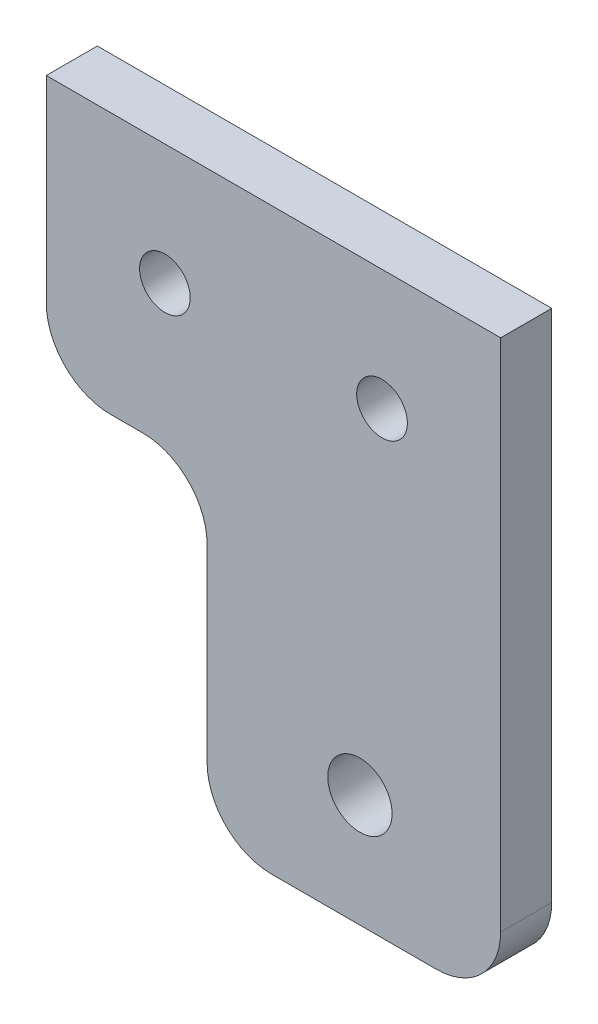
ISO-10303-21;
HEADER;
FILE_DESCRIPTION(('STEP AP214'),'2;1');
FILE_NAME('part.step','',(''),(''),'','','');
FILE_SCHEMA(('AUTOMOTIVE_DESIGN { 1 0 10303 214 1 1 1 1 }'));
ENDSEC;
DATA;
#1=APPLICATION_CONTEXT('core data for automotive mechanical design processes');
#2=APPLICATION_PROTOCOL_DEFINITION('international standard','automotive_design',2000,#1);
#3=PRODUCT_CONTEXT('',#1,'mechanical');
#4=PRODUCT('Part','Part','',(#3));
#5=PRODUCT_RELATED_PRODUCT_CATEGORY('part','',(#4));
#6=PRODUCT_DEFINITION_FORMATION('','',#4);
#7=PRODUCT_DEFINITION_CONTEXT('part definition',#1,'design');
#8=PRODUCT_DEFINITION('design','',#6,#7);
#9=PRODUCT_DEFINITION_SHAPE('','',#8);
#10=(LENGTH_UNIT() NAMED_UNIT(*) SI_UNIT(.MILLI.,.METRE.));
#11=(NAMED_UNIT(*) PLANE_ANGLE_UNIT() SI_UNIT($,.RADIAN.));
#12=(NAMED_UNIT(*) SI_UNIT($,.STERADIAN.) SOLID_ANGLE_UNIT());
#13=UNCERTAINTY_MEASURE_WITH_UNIT(LENGTH_MEASURE(1.E-05),#10,'distance_accuracy_value','');
#14=(GEOMETRIC_REPRESENTATION_CONTEXT(3) GLOBAL_UNCERTAINTY_ASSIGNED_CONTEXT((#13)) GLOBAL_UNIT_ASSIGNED_CONTEXT((#10,
#11,#12)) REPRESENTATION_CONTEXT('',''));
#15=CARTESIAN_POINT('',(0.,0.,0.));
#16=DIRECTION('',(0.,0.,1.));
#17=DIRECTION('',(1.,0.,0.));
#18=AXIS2_PLACEMENT_3D('',#15,#16,#17);
#19=CARTESIAN_POINT('',(0.,0.,6.35));
#20=DIRECTION('',(0.,0.,-1.));
#21=DIRECTION('',(-1.,0.,0.));
#22=AXIS2_PLACEMENT_3D('',#19,#20,#21);
#23=PLANE('',#22);
#24=DIRECTION('',(1.,0.,0.));
#25=VECTOR('',#24,1.);
#26=CARTESIAN_POINT('',(-36.5,0.,6.35));
#27=LINE('',#26,#25);
#28=CARTESIAN_POINT('',(-28.5,0.,6.35));
#29=VERTEX_POINT('',#28);
#30=CARTESIAN_POINT('',(-8.,0.,6.35));
#31=VERTEX_POINT('',#30);
#32=EDGE_CURVE('E140',#29,#31,#27,.T.);
#33=ORIENTED_EDGE('',*,*,#32,.T.);
#34=CARTESIAN_POINT('',(-8.,8.,6.35));
#35=DIRECTION('',(0.,0.,-1.));
#36=DIRECTION('',(-1.,0.,0.));
#37=AXIS2_PLACEMENT_3D('',#34,#35,#36);
#38=CIRCLE('',#37,8.);
#39=CARTESIAN_POINT('',(0.,8.,6.35));
#40=VERTEX_POINT('',#39);
#41=EDGE_CURVE('E116',#31,#40,#38,.F.);
#42=ORIENTED_EDGE('',*,*,#41,.T.);
#43=DIRECTION('',(0.,1.,0.));
#44=VECTOR('',#43,1.);
#45=CARTESIAN_POINT('',(0.,0.,6.35));
#46=LINE('',#45,#44);
#47=CARTESIAN_POINT('',(0.,72.,6.35));
#48=VERTEX_POINT('',#47);
#49=EDGE_CURVE('E108',#40,#48,#46,.T.);
#50=ORIENTED_EDGE('',*,*,#49,.T.);
#51=DIRECTION('',(-1.,0.,0.));
#52=VECTOR('',#51,1.);
#53=CARTESIAN_POINT('',(-56.5,72.,6.35));
#54=LINE('',#53,#52);
#55=CARTESIAN_POINT('',(-56.5,72.,6.35));
#56=VERTEX_POINT('',#55);
#57=EDGE_CURVE('E113',#48,#56,#54,.T.);
#58=ORIENTED_EDGE('',*,*,#57,.T.);
#59=DIRECTION('',(0.,-1.,0.));
#60=VECTOR('',#59,1.);
#61=CARTESIAN_POINT('',(-56.5,39.5,6.35));
#62=LINE('',#61,#60);
#63=CARTESIAN_POINT('',(-56.5,47.5,6.35));
#64=VERTEX_POINT('',#63);
#65=EDGE_CURVE('E130',#56,#64,#62,.T.);
#66=ORIENTED_EDGE('',*,*,#65,.T.);
#67=CARTESIAN_POINT('',(-48.5,47.5,6.35));
#68=DIRECTION('',(0.,0.,-1.));
#69=DIRECTION('',(-1.,0.,0.));
#70=AXIS2_PLACEMENT_3D('',#67,#68,#69);
#71=CIRCLE('',#70,8.);
#72=CARTESIAN_POINT('',(-48.5,39.5,6.35));
#73=VERTEX_POINT('',#72);
#74=EDGE_CURVE('E154',#64,#73,#71,.F.);
#75=ORIENTED_EDGE('',*,*,#74,.T.);
#76=DIRECTION('',(1.,0.,0.));
#77=VECTOR('',#76,1.);
#78=CARTESIAN_POINT('',(-56.5,39.5,6.35));
#79=LINE('',#78,#77);
#80=CARTESIAN_POINT('',(-44.5,39.5,6.35));
#81=VERTEX_POINT('',#80);
#82=EDGE_CURVE('E190',#73,#81,#79,.T.);
#83=ORIENTED_EDGE('',*,*,#82,.T.);
#84=CARTESIAN_POINT('',(-44.5,31.5,6.35));
#85=DIRECTION('',(0.,0.,-1.));
#86=DIRECTION('',(-1.,0.,0.));
#87=AXIS2_PLACEMENT_3D('',#84,#85,#86);
#88=CIRCLE('',#87,8.);
#89=CARTESIAN_POINT('',(-36.5,31.5,6.35));
#90=VERTEX_POINT('',#89);
#91=EDGE_CURVE('E11',#81,#90,#88,.T.);
#92=ORIENTED_EDGE('',*,*,#91,.T.);
#93=DIRECTION('',(0.,-1.,0.));
#94=VECTOR('',#93,1.);
#95=CARTESIAN_POINT('',(-36.5,39.5,6.35));
#96=LINE('',#95,#94);
#97=CARTESIAN_POINT('',(-36.5,8.,6.35));
#98=VERTEX_POINT('',#97);
#99=EDGE_CURVE('E188',#90,#98,#96,.T.);
#100=ORIENTED_EDGE('',*,*,#99,.T.);
#101=CARTESIAN_POINT('',(-28.5,8.,6.35));
#102=DIRECTION('',(0.,0.,-1.));
#103=DIRECTION('',(-1.,0.,0.));
#104=AXIS2_PLACEMENT_3D('',#101,#102,#103);
#105=CIRCLE('',#104,8.);
#106=EDGE_CURVE('E156',#98,#29,#105,.F.);
#107=ORIENTED_EDGE('',*,*,#106,.T.);
#108=EDGE_LOOP('',(#33,#42,#50,#58,#66,#75,#83,#92,#100,#107));
#109=FACE_BOUND('',#108,.T.);
#110=CARTESIAN_POINT('',(-41.75,57.,6.35));
#111=DIRECTION('',(0.,0.,1.));
#112=DIRECTION('',(1.,0.,0.));
#113=AXIS2_PLACEMENT_3D('',#110,#111,#112);
#114=CIRCLE('',#113,3.15);
#115=CARTESIAN_POINT('',(-38.6,57.,6.35));
#116=VERTEX_POINT('',#115);
#117=EDGE_CURVE('E198',#116,#116,#114,.T.);
#118=ORIENTED_EDGE('',*,*,#117,.F.);
#119=EDGE_LOOP('',(#118));
#120=FACE_BOUND('',#119,.T.);
#121=CARTESIAN_POINT('',(-14.75,57.,6.35));
#122=DIRECTION('',(0.,0.,1.));
#123=DIRECTION('',(1.,0.,0.));
#124=AXIS2_PLACEMENT_3D('',#121,#122,#123);
#125=CIRCLE('',#124,3.15);
#126=CARTESIAN_POINT('',(-11.6,57.,6.35));
#127=VERTEX_POINT('',#126);
#128=EDGE_CURVE('E220',#127,#127,#125,.T.);
#129=ORIENTED_EDGE('',*,*,#128,.F.);
#130=EDGE_LOOP('',(#129));
#131=FACE_BOUND('',#130,.T.);
#132=CARTESIAN_POINT('',(-17.5,13.997620055147,6.35));
#133=DIRECTION('',(0.,0.,1.));
#134=DIRECTION('',(1.,0.,0.));
#135=AXIS2_PLACEMENT_3D('',#132,#133,#134);
#136=CIRCLE('',#135,4.);
#137=CARTESIAN_POINT('',(-13.5,13.997620055147,6.35));
#138=VERTEX_POINT('',#137);
#139=EDGE_CURVE('E229',#138,#138,#136,.T.);
#140=ORIENTED_EDGE('',*,*,#139,.F.);
#141=EDGE_LOOP('',(#140));
#142=FACE_BOUND('',#141,.T.);
#143=ADVANCED_FACE('F33',(#109,#120,#131,#142),#23,.F.);
#144=CARTESIAN_POINT('',(0.,0.,0.));
#145=DIRECTION('',(0.,0.,-1.));
#146=DIRECTION('',(-1.,0.,0.));
#147=AXIS2_PLACEMENT_3D('',#144,#145,#146);
#148=PLANE('',#147);
#149=CARTESIAN_POINT('',(-14.75,57.,0.));
#150=DIRECTION('',(0.,0.,1.));
#151=DIRECTION('',(1.,0.,0.));
#152=AXIS2_PLACEMENT_3D('',#149,#150,#151);
#153=CIRCLE('',#152,3.15);
#154=CARTESIAN_POINT('',(-11.6,57.,0.));
#155=VERTEX_POINT('',#154);
#156=EDGE_CURVE('E223',#155,#155,#153,.T.);
#157=ORIENTED_EDGE('',*,*,#156,.T.);
#158=EDGE_LOOP('',(#157));
#159=FACE_BOUND('',#158,.T.);
#160=DIRECTION('',(0.,1.,0.));
#161=VECTOR('',#160,1.);
#162=CARTESIAN_POINT('',(0.,0.,0.));
#163=LINE('',#162,#161);
#164=CARTESIAN_POINT('',(0.,8.,0.));
#165=VERTEX_POINT('',#164);
#166=CARTESIAN_POINT('',(0.,72.,0.));
#167=VERTEX_POINT('',#166);
#168=EDGE_CURVE('E134',#165,#167,#163,.T.);
#169=ORIENTED_EDGE('',*,*,#168,.F.);
#170=CARTESIAN_POINT('',(-8.,8.,0.));
#171=DIRECTION('',(0.,0.,-1.));
#172=DIRECTION('',(-1.,0.,0.));
#173=AXIS2_PLACEMENT_3D('',#170,#171,#172);
#174=CIRCLE('',#173,8.);
#175=CARTESIAN_POINT('',(-8.,0.,0.));
#176=VERTEX_POINT('',#175);
#177=EDGE_CURVE('E147',#165,#176,#174,.T.);
#178=ORIENTED_EDGE('',*,*,#177,.T.);
#179=DIRECTION('',(1.,0.,0.));
#180=VECTOR('',#179,1.);
#181=CARTESIAN_POINT('',(-36.5,0.,0.));
#182=LINE('',#181,#180);
#183=CARTESIAN_POINT('',(-28.5,0.,0.));
#184=VERTEX_POINT('',#183);
#185=EDGE_CURVE('E121',#184,#176,#182,.T.);
#186=ORIENTED_EDGE('',*,*,#185,.F.);
#187=CARTESIAN_POINT('',(-28.5,8.,0.));
#188=DIRECTION('',(0.,0.,-1.));
#189=DIRECTION('',(-1.,0.,0.));
#190=AXIS2_PLACEMENT_3D('',#187,#188,#189);
#191=CIRCLE('',#190,8.);
#192=CARTESIAN_POINT('',(-36.5,8.,0.));
#193=VERTEX_POINT('',#192);
#194=EDGE_CURVE('E145',#184,#193,#191,.T.);
#195=ORIENTED_EDGE('',*,*,#194,.T.);
#196=DIRECTION('',(0.,-1.,0.));
#197=VECTOR('',#196,1.);
#198=CARTESIAN_POINT('',(-36.5,39.5,0.));
#199=LINE('',#198,#197);
#200=CARTESIAN_POINT('',(-36.5,31.5,0.));
#201=VERTEX_POINT('',#200);
#202=EDGE_CURVE('E176',#201,#193,#199,.T.);
#203=ORIENTED_EDGE('',*,*,#202,.F.);
#204=CARTESIAN_POINT('',(-44.5,31.5,0.));
#205=DIRECTION('',(0.,0.,-1.));
#206=DIRECTION('',(-1.,0.,0.));
#207=AXIS2_PLACEMENT_3D('',#204,#205,#206);
#208=CIRCLE('',#207,8.);
#209=CARTESIAN_POINT('',(-44.5,39.5,0.));
#210=VERTEX_POINT('',#209);
#211=EDGE_CURVE('E41',#201,#210,#208,.F.);
#212=ORIENTED_EDGE('',*,*,#211,.T.);
#213=DIRECTION('',(1.,0.,0.));
#214=VECTOR('',#213,1.);
#215=CARTESIAN_POINT('',(-56.5,39.5,0.));
#216=LINE('',#215,#214);
#217=CARTESIAN_POINT('',(-48.5,39.5,0.));
#218=VERTEX_POINT('',#217);
#219=EDGE_CURVE('E175',#218,#210,#216,.T.);
#220=ORIENTED_EDGE('',*,*,#219,.F.);
#221=CARTESIAN_POINT('',(-48.5,47.5,0.));
#222=DIRECTION('',(0.,0.,-1.));
#223=DIRECTION('',(-1.,0.,0.));
#224=AXIS2_PLACEMENT_3D('',#221,#222,#223);
#225=CIRCLE('',#224,8.);
#226=CARTESIAN_POINT('',(-56.5,47.5,0.));
#227=VERTEX_POINT('',#226);
#228=EDGE_CURVE('E138',#218,#227,#225,.T.);
#229=ORIENTED_EDGE('',*,*,#228,.T.);
#230=DIRECTION('',(0.,-1.,0.));
#231=VECTOR('',#230,1.);
#232=CARTESIAN_POINT('',(-56.5,39.5,0.));
#233=LINE('',#232,#231);
#234=CARTESIAN_POINT('',(-56.5,72.,0.));
#235=VERTEX_POINT('',#234);
#236=EDGE_CURVE('E184',#235,#227,#233,.T.);
#237=ORIENTED_EDGE('',*,*,#236,.F.);
#238=DIRECTION('',(-1.,0.,0.));
#239=VECTOR('',#238,1.);
#240=CARTESIAN_POINT('',(-56.5,72.,0.));
#241=LINE('',#240,#239);
#242=EDGE_CURVE('E197',#167,#235,#241,.T.);
#243=ORIENTED_EDGE('',*,*,#242,.F.);
#244=EDGE_LOOP('',(#169,#178,#186,#195,#203,#212,#220,#229,#237,#243));
#245=FACE_BOUND('',#244,.T.);
#246=CARTESIAN_POINT('',(-41.75,57.,0.));
#247=DIRECTION('',(0.,0.,1.));
#248=DIRECTION('',(1.,0.,0.));
#249=AXIS2_PLACEMENT_3D('',#246,#247,#248);
#250=CIRCLE('',#249,3.15);
#251=CARTESIAN_POINT('',(-38.6,57.,0.));
#252=VERTEX_POINT('',#251);
#253=EDGE_CURVE('E217',#252,#252,#250,.T.);
#254=ORIENTED_EDGE('',*,*,#253,.T.);
#255=EDGE_LOOP('',(#254));
#256=FACE_BOUND('',#255,.T.);
#257=CARTESIAN_POINT('',(-17.5,13.997620055147,0.));
#258=DIRECTION('',(0.,0.,1.));
#259=DIRECTION('',(1.,0.,0.));
#260=AXIS2_PLACEMENT_3D('',#257,#258,#259);
#261=CIRCLE('',#260,4.);
#262=CARTESIAN_POINT('',(-13.5,13.997620055147,0.));
#263=VERTEX_POINT('',#262);
#264=EDGE_CURVE('E226',#263,#263,#261,.T.);
#265=ORIENTED_EDGE('',*,*,#264,.T.);
#266=EDGE_LOOP('',(#265));
#267=FACE_BOUND('',#266,.T.);
#268=ADVANCED_FACE('F173',(#159,#245,#256,#267),#148,.T.);
#269=CARTESIAN_POINT('',(0.,0.,6.35));
#270=DIRECTION('',(-1.,0.,0.));
#271=DIRECTION('',(0.,0.,1.));
#272=AXIS2_PLACEMENT_3D('',#269,#270,#271);
#273=PLANE('',#272);
#274=ORIENTED_EDGE('',*,*,#49,.F.);
#275=DIRECTION('',(0.,0.,-1.));
#276=VECTOR('',#275,1.);
#277=CARTESIAN_POINT('',(0.,8.,6.35));
#278=LINE('',#277,#276);
#279=EDGE_CURVE('E136',#40,#165,#278,.T.);
#280=ORIENTED_EDGE('',*,*,#279,.T.);
#281=ORIENTED_EDGE('',*,*,#168,.T.);
#282=DIRECTION('',(0.,0.,-1.));
#283=VECTOR('',#282,1.);
#284=CARTESIAN_POINT('',(0.,72.,6.35));
#285=LINE('',#284,#283);
#286=EDGE_CURVE('E126',#48,#167,#285,.T.);
#287=ORIENTED_EDGE('',*,*,#286,.F.);
#288=EDGE_LOOP('',(#274,#280,#281,#287));
#289=FACE_BOUND('',#288,.T.);
#290=ADVANCED_FACE('F132',(#289),#273,.F.);
#291=CARTESIAN_POINT('',(-56.5,72.,6.35));
#292=DIRECTION('',(0.,-1.,0.));
#293=DIRECTION('',(0.,0.,-1.));
#294=AXIS2_PLACEMENT_3D('',#291,#292,#293);
#295=PLANE('',#294);
#296=ORIENTED_EDGE('',*,*,#242,.T.);
#297=DIRECTION('',(0.,0.,-1.));
#298=VECTOR('',#297,1.);
#299=CARTESIAN_POINT('',(-56.5,72.,6.35));
#300=LINE('',#299,#298);
#301=EDGE_CURVE('E128',#56,#235,#300,.T.);
#302=ORIENTED_EDGE('',*,*,#301,.F.);
#303=ORIENTED_EDGE('',*,*,#57,.F.);
#304=ORIENTED_EDGE('',*,*,#286,.T.);
#305=EDGE_LOOP('',(#296,#302,#303,#304));
#306=FACE_BOUND('',#305,.T.);
#307=ADVANCED_FACE('F125',(#306),#295,.F.);
#308=CARTESIAN_POINT('',(-56.5,39.5,6.35));
#309=DIRECTION('',(1.,0.,0.));
#310=DIRECTION('',(0.,0.,-1.));
#311=AXIS2_PLACEMENT_3D('',#308,#309,#310);
#312=PLANE('',#311);
#313=ORIENTED_EDGE('',*,*,#236,.T.);
#314=DIRECTION('',(0.,0.,-1.));
#315=VECTOR('',#314,1.);
#316=CARTESIAN_POINT('',(-56.5,47.5,6.35));
#317=LINE('',#316,#315);
#318=EDGE_CURVE('E168',#227,#64,#317,.F.);
#319=ORIENTED_EDGE('',*,*,#318,.T.);
#320=ORIENTED_EDGE('',*,*,#65,.F.);
#321=ORIENTED_EDGE('',*,*,#301,.T.);
#322=EDGE_LOOP('',(#313,#319,#320,#321));
#323=FACE_BOUND('',#322,.T.);
#324=ADVANCED_FACE('F213',(#323),#312,.F.);
#325=CARTESIAN_POINT('',(-56.5,39.5,6.35));
#326=DIRECTION('',(0.,1.,0.));
#327=DIRECTION('',(0.,0.,1.));
#328=AXIS2_PLACEMENT_3D('',#325,#326,#327);
#329=PLANE('',#328);
#330=ORIENTED_EDGE('',*,*,#219,.T.);
#331=DIRECTION('',(0.,0.,-1.));
#332=VECTOR('',#331,1.);
#333=CARTESIAN_POINT('',(-44.5,39.5,6.35));
#334=LINE('',#333,#332);
#335=EDGE_CURVE('E166',#210,#81,#334,.F.);
#336=ORIENTED_EDGE('',*,*,#335,.T.);
#337=ORIENTED_EDGE('',*,*,#82,.F.);
#338=DIRECTION('',(0.,0.,-1.));
#339=VECTOR('',#338,1.);
#340=CARTESIAN_POINT('',(-48.5,39.5,6.35));
#341=LINE('',#340,#339);
#342=EDGE_CURVE('E163',#73,#218,#341,.T.);
#343=ORIENTED_EDGE('',*,*,#342,.T.);
#344=EDGE_LOOP('',(#330,#336,#337,#343));
#345=FACE_BOUND('',#344,.T.);
#346=ADVANCED_FACE('F181',(#345),#329,.F.);
#347=CARTESIAN_POINT('',(-36.5,39.5,6.35));
#348=DIRECTION('',(1.,0.,0.));
#349=DIRECTION('',(0.,0.,-1.));
#350=AXIS2_PLACEMENT_3D('',#347,#348,#349);
#351=PLANE('',#350);
#352=ORIENTED_EDGE('',*,*,#202,.T.);
#353=DIRECTION('',(0.,0.,-1.));
#354=VECTOR('',#353,1.);
#355=CARTESIAN_POINT('',(-36.5,8.,6.35));
#356=LINE('',#355,#354);
#357=EDGE_CURVE('E48',#193,#98,#356,.F.);
#358=ORIENTED_EDGE('',*,*,#357,.T.);
#359=ORIENTED_EDGE('',*,*,#99,.F.);
#360=DIRECTION('',(0.,0.,-1.));
#361=VECTOR('',#360,1.);
#362=CARTESIAN_POINT('',(-36.5,31.5,0.));
#363=LINE('',#362,#361);
#364=EDGE_CURVE('E159',#90,#201,#363,.T.);
#365=ORIENTED_EDGE('',*,*,#364,.T.);
#366=EDGE_LOOP('',(#352,#358,#359,#365));
#367=FACE_BOUND('',#366,.T.);
#368=ADVANCED_FACE('F187',(#367),#351,.F.);
#369=CARTESIAN_POINT('',(-36.5,0.,6.35));
#370=DIRECTION('',(0.,1.,0.));
#371=DIRECTION('',(0.,0.,1.));
#372=AXIS2_PLACEMENT_3D('',#369,#370,#371);
#373=PLANE('',#372);
#374=ORIENTED_EDGE('',*,*,#185,.T.);
#375=DIRECTION('',(0.,0.,-1.));
#376=VECTOR('',#375,1.);
#377=CARTESIAN_POINT('',(-8.,0.,6.35));
#378=LINE('',#377,#376);
#379=EDGE_CURVE('E152',#176,#31,#378,.F.);
#380=ORIENTED_EDGE('',*,*,#379,.T.);
#381=ORIENTED_EDGE('',*,*,#32,.F.);
#382=DIRECTION('',(0.,0.,-1.));
#383=VECTOR('',#382,1.);
#384=CARTESIAN_POINT('',(-28.5,0.,6.35));
#385=LINE('',#384,#383);
#386=EDGE_CURVE('E149',#29,#184,#385,.T.);
#387=ORIENTED_EDGE('',*,*,#386,.T.);
#388=EDGE_LOOP('',(#374,#380,#381,#387));
#389=FACE_BOUND('',#388,.T.);
#390=ADVANCED_FACE('F206',(#389),#373,.F.);
#391=CARTESIAN_POINT('',(-41.75,57.,6.35));
#392=DIRECTION('',(0.,0.,-1.));
#393=DIRECTION('',(-1.,0.,0.));
#394=AXIS2_PLACEMENT_3D('',#391,#392,#393);
#395=CYLINDRICAL_SURFACE('',#394,3.15);
#396=ORIENTED_EDGE('',*,*,#117,.T.);
#397=EDGE_LOOP('',(#396));
#398=FACE_BOUND('',#397,.T.);
#399=ORIENTED_EDGE('',*,*,#253,.F.);
#400=EDGE_LOOP('',(#399));
#401=FACE_BOUND('',#400,.T.);
#402=ADVANCED_FACE('F250',(#398,#401),#395,.F.);
#403=CARTESIAN_POINT('',(-14.75,57.,6.35));
#404=DIRECTION('',(0.,0.,-1.));
#405=DIRECTION('',(-1.,0.,0.));
#406=AXIS2_PLACEMENT_3D('',#403,#404,#405);
#407=CYLINDRICAL_SURFACE('',#406,3.15);
#408=ORIENTED_EDGE('',*,*,#128,.T.);
#409=EDGE_LOOP('',(#408));
#410=FACE_BOUND('',#409,.T.);
#411=ORIENTED_EDGE('',*,*,#156,.F.);
#412=EDGE_LOOP('',(#411));
#413=FACE_BOUND('',#412,.T.);
#414=ADVANCED_FACE('F268',(#410,#413),#407,.F.);
#415=CARTESIAN_POINT('',(-8.,8.,6.35));
#416=DIRECTION('',(0.,0.,-1.));
#417=DIRECTION('',(-1.,0.,0.));
#418=AXIS2_PLACEMENT_3D('',#415,#416,#417);
#419=CYLINDRICAL_SURFACE('',#418,8.);
#420=ORIENTED_EDGE('',*,*,#41,.F.);
#421=ORIENTED_EDGE('',*,*,#379,.F.);
#422=ORIENTED_EDGE('',*,*,#177,.F.);
#423=ORIENTED_EDGE('',*,*,#279,.F.);
#424=EDGE_LOOP('',(#420,#421,#422,#423));
#425=FACE_BOUND('',#424,.T.);
#426=ADVANCED_FACE('F210',(#425),#419,.T.);
#427=CARTESIAN_POINT('',(-28.5,8.,6.35));
#428=DIRECTION('',(0.,0.,-1.));
#429=DIRECTION('',(-1.,0.,0.));
#430=AXIS2_PLACEMENT_3D('',#427,#428,#429);
#431=CYLINDRICAL_SURFACE('',#430,8.);
#432=ORIENTED_EDGE('',*,*,#106,.F.);
#433=ORIENTED_EDGE('',*,*,#357,.F.);
#434=ORIENTED_EDGE('',*,*,#194,.F.);
#435=ORIENTED_EDGE('',*,*,#386,.F.);
#436=EDGE_LOOP('',(#432,#433,#434,#435));
#437=FACE_BOUND('',#436,.T.);
#438=ADVANCED_FACE('F267',(#437),#431,.T.);
#439=CARTESIAN_POINT('',(-44.5,31.5,6.35));
#440=DIRECTION('',(0.,0.,1.));
#441=DIRECTION('',(1.,0.,0.));
#442=AXIS2_PLACEMENT_3D('',#439,#440,#441);
#443=CYLINDRICAL_SURFACE('',#442,8.);
#444=ORIENTED_EDGE('',*,*,#91,.F.);
#445=ORIENTED_EDGE('',*,*,#335,.F.);
#446=ORIENTED_EDGE('',*,*,#211,.F.);
#447=ORIENTED_EDGE('',*,*,#364,.F.);
#448=EDGE_LOOP('',(#444,#445,#446,#447));
#449=FACE_BOUND('',#448,.T.);
#450=ADVANCED_FACE('F186',(#449),#443,.F.);
#451=CARTESIAN_POINT('',(-48.5,47.5,6.35));
#452=DIRECTION('',(0.,0.,-1.));
#453=DIRECTION('',(-1.,0.,0.));
#454=AXIS2_PLACEMENT_3D('',#451,#452,#453);
#455=CYLINDRICAL_SURFACE('',#454,8.);
#456=ORIENTED_EDGE('',*,*,#74,.F.);
#457=ORIENTED_EDGE('',*,*,#318,.F.);
#458=ORIENTED_EDGE('',*,*,#228,.F.);
#459=ORIENTED_EDGE('',*,*,#342,.F.);
#460=EDGE_LOOP('',(#456,#457,#458,#459));
#461=FACE_BOUND('',#460,.T.);
#462=ADVANCED_FACE('F35',(#461),#455,.T.);
#463=CARTESIAN_POINT('',(-17.5,13.997620055147,0.));
#464=DIRECTION('',(0.,0.,1.));
#465=DIRECTION('',(1.,0.,0.));
#466=AXIS2_PLACEMENT_3D('',#463,#464,#465);
#467=CYLINDRICAL_SURFACE('',#466,4.);
#468=ORIENTED_EDGE('',*,*,#264,.F.);
#469=EDGE_LOOP('',(#468));
#470=FACE_BOUND('',#469,.T.);
#471=ORIENTED_EDGE('',*,*,#139,.T.);
#472=EDGE_LOOP('',(#471));
#473=FACE_BOUND('',#472,.T.);
#474=ADVANCED_FACE('F236',(#470,#473),#467,.F.);
#475=CLOSED_SHELL('',(#143,#268,#290,#307,#324,#346,#368,#390,#402,#414,#426,#438,#450,#462,#474));
#476=MANIFOLD_SOLID_BREP('B2',#475);
#477=ADVANCED_BREP_SHAPE_REPRESENTATION('',(#18,#476),#14);
#478=SHAPE_DEFINITION_REPRESENTATION(#9,#477);
ENDSEC;
END-ISO-10303-21;
